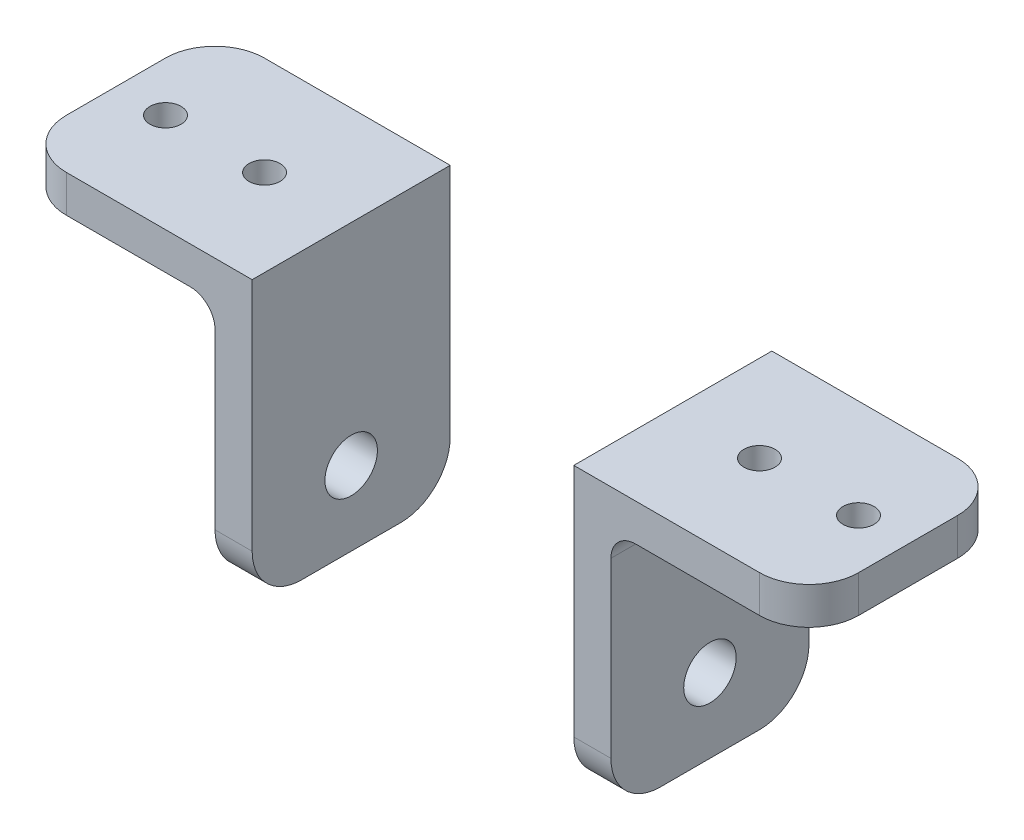
ISO-10303-21;
HEADER;
FILE_DESCRIPTION(('STEP AP214'),'2;1');
FILE_NAME('part.step','',(''),(''),'','','');
FILE_SCHEMA(('AUTOMOTIVE_DESIGN { 1 0 10303 214 1 1 1 1 }'));
ENDSEC;
DATA;
#1=APPLICATION_CONTEXT('core data for automotive mechanical design processes');
#2=APPLICATION_PROTOCOL_DEFINITION('international standard','automotive_design',2000,#1);
#3=PRODUCT_CONTEXT('',#1,'mechanical');
#4=PRODUCT('Part','Part','',(#3));
#5=PRODUCT_RELATED_PRODUCT_CATEGORY('part','',(#4));
#6=PRODUCT_DEFINITION_FORMATION('','',#4);
#7=PRODUCT_DEFINITION_CONTEXT('part definition',#1,'design');
#8=PRODUCT_DEFINITION('design','',#6,#7);
#9=PRODUCT_DEFINITION_SHAPE('','',#8);
#10=(LENGTH_UNIT() NAMED_UNIT(*) SI_UNIT(.MILLI.,.METRE.));
#11=(NAMED_UNIT(*) PLANE_ANGLE_UNIT() SI_UNIT($,.RADIAN.));
#12=(NAMED_UNIT(*) SI_UNIT($,.STERADIAN.) SOLID_ANGLE_UNIT());
#13=UNCERTAINTY_MEASURE_WITH_UNIT(LENGTH_MEASURE(1.E-05),#10,'distance_accuracy_value','');
#14=(GEOMETRIC_REPRESENTATION_CONTEXT(3) GLOBAL_UNCERTAINTY_ASSIGNED_CONTEXT((#13)) GLOBAL_UNIT_ASSIGNED_CONTEXT((#10,
#11,#12)) REPRESENTATION_CONTEXT('',''));
#15=CARTESIAN_POINT('',(0.,0.,0.));
#16=DIRECTION('',(0.,0.,1.));
#17=DIRECTION('',(1.,0.,0.));
#18=AXIS2_PLACEMENT_3D('',#15,#16,#17);
#19=CARTESIAN_POINT('',(260.35,-50.8,1168.4));
#20=DIRECTION('',(0.,-1.,0.));
#21=DIRECTION('',(0.,0.,-1.));
#22=AXIS2_PLACEMENT_3D('',#19,#20,#21);
#23=PLANE('',#22);
#24=CARTESIAN_POINT('',(304.7873,-50.8,1181.1));
#25=DIRECTION('',(0.,-1.,0.));
#26=DIRECTION('',(0.,0.,-1.));
#27=AXIS2_PLACEMENT_3D('',#24,#25,#26);
#28=CIRCLE('',#27,1.9939);
#29=CARTESIAN_POINT('',(304.7873,-50.8,1179.1061));
#30=VERTEX_POINT('',#29);
#31=EDGE_CURVE('P0_E132',#30,#30,#28,.F.);
#32=ORIENTED_EDGE('',*,*,#31,.F.);
#33=EDGE_LOOP('',(#32));
#34=FACE_BOUND('',#33,.T.);
#35=CARTESIAN_POINT('',(292.0873,-50.8,1181.1));
#36=DIRECTION('',(0.,-1.,0.));
#37=DIRECTION('',(0.,0.,-1.));
#38=AXIS2_PLACEMENT_3D('',#35,#36,#37);
#39=CIRCLE('',#38,1.9939);
#40=CARTESIAN_POINT('',(292.0873,-50.8,1179.1061));
#41=VERTEX_POINT('',#40);
#42=EDGE_CURVE('P0_E343',#41,#41,#39,.F.);
#43=ORIENTED_EDGE('',*,*,#42,.F.);
#44=EDGE_LOOP('',(#43));
#45=FACE_BOUND('',#44,.T.);
#46=DIRECTION('',(0.,0.,1.));
#47=VECTOR('',#46,1.);
#48=CARTESIAN_POINT('',(311.15,-50.8,1168.4));
#49=LINE('',#48,#47);
#50=CARTESIAN_POINT('',(311.15,-50.8,1174.75));
#51=VERTEX_POINT('',#50);
#52=CARTESIAN_POINT('',(311.15,-50.8,1187.45));
#53=VERTEX_POINT('',#52);
#54=EDGE_CURVE('P0_E139',#51,#53,#49,.T.);
#55=ORIENTED_EDGE('',*,*,#54,.F.);
#56=CARTESIAN_POINT('',(304.8,-50.8,1174.75));
#57=DIRECTION('',(0.,-1.,0.));
#58=DIRECTION('',(0.,0.,-1.));
#59=AXIS2_PLACEMENT_3D('',#56,#57,#58);
#60=CIRCLE('',#59,6.35);
#61=CARTESIAN_POINT('',(304.8,-50.8,1168.4));
#62=VERTEX_POINT('',#61);
#63=EDGE_CURVE('P0_E125',#51,#62,#60,.F.);
#64=ORIENTED_EDGE('',*,*,#63,.T.);
#65=DIRECTION('',(1.,0.,0.));
#66=VECTOR('',#65,1.);
#67=CARTESIAN_POINT('',(260.35,-50.8,1168.4));
#68=LINE('',#67,#66);
#69=CARTESIAN_POINT('',(280.9748,-50.8,1168.4));
#70=VERTEX_POINT('',#69);
#71=EDGE_CURVE('P0_E118',#70,#62,#68,.T.);
#72=ORIENTED_EDGE('',*,*,#71,.F.);
#73=DIRECTION('',(0.,0.,1.));
#74=VECTOR('',#73,1.);
#75=CARTESIAN_POINT('',(280.9748,-50.8,1168.4));
#76=LINE('',#75,#74);
#77=CARTESIAN_POINT('',(280.9748,-50.8,1193.8));
#78=VERTEX_POINT('',#77);
#79=EDGE_CURVE('P0_E101',#70,#78,#76,.T.);
#80=ORIENTED_EDGE('',*,*,#79,.T.);
#81=DIRECTION('',(1.,0.,0.));
#82=VECTOR('',#81,1.);
#83=CARTESIAN_POINT('',(260.35,-50.8,1193.8));
#84=LINE('',#83,#82);
#85=CARTESIAN_POINT('',(304.8,-50.8,1193.8));
#86=VERTEX_POINT('',#85);
#87=EDGE_CURVE('P0_E140',#78,#86,#84,.T.);
#88=ORIENTED_EDGE('',*,*,#87,.T.);
#89=CARTESIAN_POINT('',(304.8,-50.8,1187.45));
#90=DIRECTION('',(0.,-1.,0.));
#91=DIRECTION('',(0.,0.,-1.));
#92=AXIS2_PLACEMENT_3D('',#89,#90,#91);
#93=CIRCLE('',#92,6.35);
#94=EDGE_CURVE('P0_E167',#86,#53,#93,.F.);
#95=ORIENTED_EDGE('',*,*,#94,.T.);
#96=EDGE_LOOP('',(#55,#64,#72,#80,#88,#95));
#97=FACE_BOUND('',#96,.T.);
#98=ADVANCED_FACE('P0_F17',(#34,#45,#97),#23,.F.);
#99=CARTESIAN_POINT('',(280.9748,-69.05625,1168.4));
#100=DIRECTION('',(-1.,0.,0.));
#101=DIRECTION('',(0.,0.,1.));
#102=AXIS2_PLACEMENT_3D('',#99,#100,#101);
#103=PLANE('',#102);
#104=CARTESIAN_POINT('',(280.9748,-77.7875,1181.1));
#105=DIRECTION('',(-1.,0.,0.));
#106=DIRECTION('',(0.,0.,1.));
#107=AXIS2_PLACEMENT_3D('',#104,#105,#106);
#108=CIRCLE('',#107,3.3655);
#109=CARTESIAN_POINT('',(280.9748,-77.7875,1184.4655));
#110=VERTEX_POINT('',#109);
#111=EDGE_CURVE('P0_E332',#110,#110,#108,.T.);
#112=ORIENTED_EDGE('',*,*,#111,.F.);
#113=EDGE_LOOP('',(#112));
#114=FACE_BOUND('',#113,.T.);
#115=DIRECTION('',(0.,-1.,0.));
#116=VECTOR('',#115,1.);
#117=CARTESIAN_POINT('',(280.9748,-69.05625,1168.4));
#118=LINE('',#117,#116);
#119=CARTESIAN_POINT('',(280.9748,-80.9625,1168.4));
#120=VERTEX_POINT('',#119);
#121=EDGE_CURVE('P0_E104',#70,#120,#118,.T.);
#122=ORIENTED_EDGE('',*,*,#121,.T.);
#123=CARTESIAN_POINT('',(280.9748,-80.9625,1174.75));
#124=DIRECTION('',(-1.,0.,0.));
#125=DIRECTION('',(0.,0.,1.));
#126=AXIS2_PLACEMENT_3D('',#123,#124,#125);
#127=CIRCLE('',#126,6.35);
#128=CARTESIAN_POINT('',(280.9748,-87.3125,1174.75));
#129=VERTEX_POINT('',#128);
#130=EDGE_CURVE('P0_E11',#120,#129,#127,.T.);
#131=ORIENTED_EDGE('',*,*,#130,.T.);
#132=DIRECTION('',(0.,0.,1.));
#133=VECTOR('',#132,1.);
#134=CARTESIAN_POINT('',(280.9748,-87.3125,1168.4));
#135=LINE('',#134,#133);
#136=CARTESIAN_POINT('',(280.9748,-87.3125,1187.45));
#137=VERTEX_POINT('',#136);
#138=EDGE_CURVE('P0_E113',#129,#137,#135,.T.);
#139=ORIENTED_EDGE('',*,*,#138,.T.);
#140=CARTESIAN_POINT('',(280.9748,-80.9625,1187.45));
#141=DIRECTION('',(-1.,0.,0.));
#142=DIRECTION('',(0.,0.,1.));
#143=AXIS2_PLACEMENT_3D('',#140,#141,#142);
#144=CIRCLE('',#143,6.35);
#145=CARTESIAN_POINT('',(280.9748,-80.9625,1193.8));
#146=VERTEX_POINT('',#145);
#147=EDGE_CURVE('P0_E25',#137,#146,#144,.T.);
#148=ORIENTED_EDGE('',*,*,#147,.T.);
#149=DIRECTION('',(0.,-1.,0.));
#150=VECTOR('',#149,1.);
#151=CARTESIAN_POINT('',(280.9748,-69.05625,1193.8));
#152=LINE('',#151,#150);
#153=EDGE_CURVE('P0_E107',#78,#146,#152,.T.);
#154=ORIENTED_EDGE('',*,*,#153,.F.);
#155=ORIENTED_EDGE('',*,*,#79,.F.);
#156=EDGE_LOOP('',(#122,#131,#139,#148,#154,#155));
#157=FACE_BOUND('',#156,.T.);
#158=ADVANCED_FACE('P0_F103',(#114,#157),#103,.T.);
#159=CARTESIAN_POINT('',(283.35605,-87.3125,1168.4));
#160=DIRECTION('',(0.,-1.,0.));
#161=DIRECTION('',(0.,0.,-1.));
#162=AXIS2_PLACEMENT_3D('',#159,#160,#161);
#163=PLANE('',#162);
#164=ORIENTED_EDGE('',*,*,#138,.F.);
#165=DIRECTION('',(1.,0.,0.));
#166=VECTOR('',#165,1.);
#167=CARTESIAN_POINT('',(285.7373,-87.3125,1174.75));
#168=LINE('',#167,#166);
#169=CARTESIAN_POINT('',(285.7373,-87.3125,1174.75));
#170=VERTEX_POINT('',#169);
#171=EDGE_CURVE('P0_E185',#129,#170,#168,.T.);
#172=ORIENTED_EDGE('',*,*,#171,.T.);
#173=DIRECTION('',(0.,0.,1.));
#174=VECTOR('',#173,1.);
#175=CARTESIAN_POINT('',(285.7373,-87.3125,1168.4));
#176=LINE('',#175,#174);
#177=CARTESIAN_POINT('',(285.7373,-87.3125,1187.45));
#178=VERTEX_POINT('',#177);
#179=EDGE_CURVE('P0_E149',#170,#178,#176,.T.);
#180=ORIENTED_EDGE('',*,*,#179,.T.);
#181=DIRECTION('',(1.,0.,0.));
#182=VECTOR('',#181,1.);
#183=CARTESIAN_POINT('',(283.35605,-87.3125,1187.45));
#184=LINE('',#183,#182);
#185=EDGE_CURVE('P0_E183',#178,#137,#184,.F.);
#186=ORIENTED_EDGE('',*,*,#185,.T.);
#187=EDGE_LOOP('',(#164,#172,#180,#186));
#188=FACE_BOUND('',#187,.T.);
#189=ADVANCED_FACE('P0_F196',(#188),#163,.T.);
#190=CARTESIAN_POINT('',(285.7373,-71.4375,1168.4));
#191=DIRECTION('',(1.,0.,0.));
#192=DIRECTION('',(0.,0.,-1.));
#193=AXIS2_PLACEMENT_3D('',#190,#191,#192);
#194=PLANE('',#193);
#195=CARTESIAN_POINT('',(285.7373,-77.7875,1181.1));
#196=DIRECTION('',(1.,0.,0.));
#197=DIRECTION('',(0.,0.,-1.));
#198=AXIS2_PLACEMENT_3D('',#195,#196,#197);
#199=CIRCLE('',#198,3.3655);
#200=CARTESIAN_POINT('',(285.7373,-77.7875,1177.7345));
#201=VERTEX_POINT('',#200);
#202=EDGE_CURVE('P0_E335',#201,#201,#199,.F.);
#203=ORIENTED_EDGE('',*,*,#202,.T.);
#204=EDGE_LOOP('',(#203));
#205=FACE_BOUND('',#204,.T.);
#206=ORIENTED_EDGE('',*,*,#179,.F.);
#207=CARTESIAN_POINT('',(285.7373,-80.9625,1174.75));
#208=DIRECTION('',(1.,0.,0.));
#209=DIRECTION('',(0.,0.,-1.));
#210=AXIS2_PLACEMENT_3D('',#207,#208,#209);
#211=CIRCLE('',#210,6.35);
#212=CARTESIAN_POINT('',(285.7373,-80.9625,1168.4));
#213=VERTEX_POINT('',#212);
#214=EDGE_CURVE('P0_E40',#170,#213,#211,.T.);
#215=ORIENTED_EDGE('',*,*,#214,.T.);
#216=DIRECTION('',(0.,1.,0.));
#217=VECTOR('',#216,1.);
#218=CARTESIAN_POINT('',(285.7373,-71.4375,1168.4));
#219=LINE('',#218,#217);
#220=CARTESIAN_POINT('',(285.7373,-58.7375,1168.4));
#221=VERTEX_POINT('',#220);
#222=EDGE_CURVE('P0_E122',#213,#221,#219,.T.);
#223=ORIENTED_EDGE('',*,*,#222,.T.);
#224=DIRECTION('',(0.,0.,1.));
#225=VECTOR('',#224,1.);
#226=CARTESIAN_POINT('',(285.7373,-58.7375,1193.8));
#227=LINE('',#226,#225);
#228=CARTESIAN_POINT('',(285.7373,-58.7375,1193.8));
#229=VERTEX_POINT('',#228);
#230=EDGE_CURVE('P0_E112',#221,#229,#227,.T.);
#231=ORIENTED_EDGE('',*,*,#230,.T.);
#232=DIRECTION('',(0.,1.,0.));
#233=VECTOR('',#232,1.);
#234=CARTESIAN_POINT('',(285.7373,-71.4375,1193.8));
#235=LINE('',#234,#233);
#236=CARTESIAN_POINT('',(285.7373,-80.9625,1193.8));
#237=VERTEX_POINT('',#236);
#238=EDGE_CURVE('P0_E129',#237,#229,#235,.T.);
#239=ORIENTED_EDGE('',*,*,#238,.F.);
#240=CARTESIAN_POINT('',(285.7373,-80.9625,1187.45));
#241=DIRECTION('',(1.,0.,0.));
#242=DIRECTION('',(0.,0.,-1.));
#243=AXIS2_PLACEMENT_3D('',#240,#241,#242);
#244=CIRCLE('',#243,6.35);
#245=EDGE_CURVE('P0_E32',#237,#178,#244,.T.);
#246=ORIENTED_EDGE('',*,*,#245,.T.);
#247=EDGE_LOOP('',(#206,#215,#223,#231,#239,#246));
#248=FACE_BOUND('',#247,.T.);
#249=ADVANCED_FACE('P0_F197',(#205,#248),#194,.T.);
#250=CARTESIAN_POINT('',(298.44365,-55.5625,1168.4));
#251=DIRECTION('',(0.,-1.,0.));
#252=DIRECTION('',(0.,0.,-1.));
#253=AXIS2_PLACEMENT_3D('',#250,#251,#252);
#254=PLANE('',#253);
#255=CARTESIAN_POINT('',(304.7873,-55.5625,1181.1));
#256=DIRECTION('',(0.,1.,0.));
#257=DIRECTION('',(0.,0.,-1.));
#258=AXIS2_PLACEMENT_3D('',#255,#256,#257);
#259=CIRCLE('',#258,1.9939);
#260=CARTESIAN_POINT('',(304.7873,-55.5625,1179.1061));
#261=VERTEX_POINT('',#260);
#262=EDGE_CURVE('P0_E340',#261,#261,#259,.T.);
#263=ORIENTED_EDGE('',*,*,#262,.T.);
#264=EDGE_LOOP('',(#263));
#265=FACE_BOUND('',#264,.T.);
#266=CARTESIAN_POINT('',(292.0873,-55.5625,1181.1));
#267=DIRECTION('',(0.,1.,0.));
#268=DIRECTION('',(0.,0.,-1.));
#269=AXIS2_PLACEMENT_3D('',#266,#267,#268);
#270=CIRCLE('',#269,1.9939);
#271=CARTESIAN_POINT('',(292.0873,-55.5625,1179.1061));
#272=VERTEX_POINT('',#271);
#273=EDGE_CURVE('P0_E337',#272,#272,#270,.T.);
#274=ORIENTED_EDGE('',*,*,#273,.T.);
#275=EDGE_LOOP('',(#274));
#276=FACE_BOUND('',#275,.T.);
#277=DIRECTION('',(1.,0.,0.));
#278=VECTOR('',#277,1.);
#279=CARTESIAN_POINT('',(298.44365,-55.5625,1168.4));
#280=LINE('',#279,#278);
#281=CARTESIAN_POINT('',(288.9123,-55.5625,1168.4));
#282=VERTEX_POINT('',#281);
#283=CARTESIAN_POINT('',(304.8,-55.5625,1168.4));
#284=VERTEX_POINT('',#283);
#285=EDGE_CURVE('P0_E136',#282,#284,#280,.T.);
#286=ORIENTED_EDGE('',*,*,#285,.T.);
#287=CARTESIAN_POINT('',(304.8,-55.5625,1174.75));
#288=DIRECTION('',(0.,-1.,0.));
#289=DIRECTION('',(0.,0.,-1.));
#290=AXIS2_PLACEMENT_3D('',#287,#288,#289);
#291=CIRCLE('',#290,6.35);
#292=CARTESIAN_POINT('',(311.15,-55.5625,1174.75));
#293=VERTEX_POINT('',#292);
#294=EDGE_CURVE('P0_E175',#284,#293,#291,.T.);
#295=ORIENTED_EDGE('',*,*,#294,.T.);
#296=DIRECTION('',(0.,0.,1.));
#297=VECTOR('',#296,1.);
#298=CARTESIAN_POINT('',(311.15,-55.5625,1168.4));
#299=LINE('',#298,#297);
#300=CARTESIAN_POINT('',(311.15,-55.5625,1187.45));
#301=VERTEX_POINT('',#300);
#302=EDGE_CURVE('P0_E146',#293,#301,#299,.T.);
#303=ORIENTED_EDGE('',*,*,#302,.T.);
#304=CARTESIAN_POINT('',(304.8,-55.5625,1187.45));
#305=DIRECTION('',(0.,-1.,0.));
#306=DIRECTION('',(0.,0.,-1.));
#307=AXIS2_PLACEMENT_3D('',#304,#305,#306);
#308=CIRCLE('',#307,6.35);
#309=CARTESIAN_POINT('',(304.8,-55.5625,1193.8));
#310=VERTEX_POINT('',#309);
#311=EDGE_CURVE('P0_E173',#301,#310,#308,.T.);
#312=ORIENTED_EDGE('',*,*,#311,.T.);
#313=DIRECTION('',(1.,0.,0.));
#314=VECTOR('',#313,1.);
#315=CARTESIAN_POINT('',(298.44365,-55.5625,1193.8));
#316=LINE('',#315,#314);
#317=CARTESIAN_POINT('',(288.9123,-55.5625,1193.8));
#318=VERTEX_POINT('',#317);
#319=EDGE_CURVE('P0_E126',#318,#310,#316,.T.);
#320=ORIENTED_EDGE('',*,*,#319,.F.);
#321=DIRECTION('',(0.,0.,1.));
#322=VECTOR('',#321,1.);
#323=CARTESIAN_POINT('',(288.9123,-55.5625,1168.4));
#324=LINE('',#323,#322);
#325=EDGE_CURVE('P0_E155',#318,#282,#324,.F.);
#326=ORIENTED_EDGE('',*,*,#325,.T.);
#327=EDGE_LOOP('',(#286,#295,#303,#312,#320,#326));
#328=FACE_BOUND('',#327,.T.);
#329=ADVANCED_FACE('P0_F237',(#265,#276,#328),#254,.T.);
#330=CARTESIAN_POINT('',(311.15,-53.18125,1168.4));
#331=DIRECTION('',(1.,0.,0.));
#332=DIRECTION('',(0.,0.,-1.));
#333=AXIS2_PLACEMENT_3D('',#330,#331,#332);
#334=PLANE('',#333);
#335=ORIENTED_EDGE('',*,*,#302,.F.);
#336=DIRECTION('',(0.,1.,0.));
#337=VECTOR('',#336,1.);
#338=CARTESIAN_POINT('',(311.15,-50.8,1174.75));
#339=LINE('',#338,#337);
#340=EDGE_CURVE('P0_E164',#293,#51,#339,.T.);
#341=ORIENTED_EDGE('',*,*,#340,.T.);
#342=ORIENTED_EDGE('',*,*,#54,.T.);
#343=DIRECTION('',(0.,1.,0.));
#344=VECTOR('',#343,1.);
#345=CARTESIAN_POINT('',(311.15,-53.18125,1187.45));
#346=LINE('',#345,#344);
#347=EDGE_CURVE('P0_E162',#53,#301,#346,.F.);
#348=ORIENTED_EDGE('',*,*,#347,.T.);
#349=EDGE_LOOP('',(#335,#341,#342,#348));
#350=FACE_BOUND('',#349,.T.);
#351=ADVANCED_FACE('P0_F240',(#350),#334,.T.);
#352=CARTESIAN_POINT('',(260.35,-43.65625,1168.4));
#353=DIRECTION('',(0.,0.,1.));
#354=DIRECTION('',(1.,0.,0.));
#355=AXIS2_PLACEMENT_3D('',#352,#353,#354);
#356=PLANE('',#355);
#357=ORIENTED_EDGE('',*,*,#71,.T.);
#358=DIRECTION('',(0.,1.,0.));
#359=VECTOR('',#358,1.);
#360=CARTESIAN_POINT('',(304.8,-55.5625,1168.4));
#361=LINE('',#360,#359);
#362=EDGE_CURVE('P0_E171',#62,#284,#361,.F.);
#363=ORIENTED_EDGE('',*,*,#362,.T.);
#364=ORIENTED_EDGE('',*,*,#285,.F.);
#365=CARTESIAN_POINT('',(288.9123,-58.7375,1168.4));
#366=DIRECTION('',(0.,0.,1.));
#367=DIRECTION('',(1.,0.,0.));
#368=AXIS2_PLACEMENT_3D('',#365,#366,#367);
#369=CIRCLE('',#368,3.175);
#370=EDGE_CURVE('P0_E159',#282,#221,#369,.T.);
#371=ORIENTED_EDGE('',*,*,#370,.T.);
#372=ORIENTED_EDGE('',*,*,#222,.F.);
#373=DIRECTION('',(1.,0.,0.));
#374=VECTOR('',#373,1.);
#375=CARTESIAN_POINT('',(280.9748,-80.9625,1168.4));
#376=LINE('',#375,#374);
#377=EDGE_CURVE('P0_E121',#213,#120,#376,.F.);
#378=ORIENTED_EDGE('',*,*,#377,.T.);
#379=ORIENTED_EDGE('',*,*,#121,.F.);
#380=EDGE_LOOP('',(#357,#363,#364,#371,#372,#378,#379));
#381=FACE_BOUND('',#380,.T.);
#382=ADVANCED_FACE('P0_F117',(#381),#356,.F.);
#383=CARTESIAN_POINT('',(260.35,-43.65625,1193.8));
#384=DIRECTION('',(0.,0.,1.));
#385=DIRECTION('',(1.,0.,0.));
#386=AXIS2_PLACEMENT_3D('',#383,#384,#385);
#387=PLANE('',#386);
#388=ORIENTED_EDGE('',*,*,#319,.T.);
#389=DIRECTION('',(0.,1.,0.));
#390=VECTOR('',#389,1.);
#391=CARTESIAN_POINT('',(304.8,-43.65625,1193.8));
#392=LINE('',#391,#390);
#393=EDGE_CURVE('P0_E180',#310,#86,#392,.T.);
#394=ORIENTED_EDGE('',*,*,#393,.T.);
#395=ORIENTED_EDGE('',*,*,#87,.F.);
#396=ORIENTED_EDGE('',*,*,#153,.T.);
#397=DIRECTION('',(1.,0.,0.));
#398=VECTOR('',#397,1.);
#399=CARTESIAN_POINT('',(260.35,-80.9625,1193.8));
#400=LINE('',#399,#398);
#401=EDGE_CURVE('P0_E177',#146,#237,#400,.T.);
#402=ORIENTED_EDGE('',*,*,#401,.T.);
#403=ORIENTED_EDGE('',*,*,#238,.T.);
#404=CARTESIAN_POINT('',(288.9123,-58.7375,1193.8));
#405=DIRECTION('',(0.,0.,1.));
#406=DIRECTION('',(1.,0.,0.));
#407=AXIS2_PLACEMENT_3D('',#404,#405,#406);
#408=CIRCLE('',#407,3.175);
#409=EDGE_CURVE('P0_E157',#229,#318,#408,.F.);
#410=ORIENTED_EDGE('',*,*,#409,.T.);
#411=EDGE_LOOP('',(#388,#394,#395,#396,#402,#403,#410));
#412=FACE_BOUND('',#411,.T.);
#413=ADVANCED_FACE('P0_F194',(#412),#387,.T.);
#414=CARTESIAN_POINT('',(292.0873,1253.44045163224,1181.1));
#415=DIRECTION('',(0.,-1.,0.));
#416=DIRECTION('',(0.,0.,-1.));
#417=AXIS2_PLACEMENT_3D('',#414,#415,#416);
#418=CYLINDRICAL_SURFACE('',#417,1.9939);
#419=ORIENTED_EDGE('',*,*,#273,.F.);
#420=EDGE_LOOP('',(#419));
#421=FACE_BOUND('',#420,.T.);
#422=ORIENTED_EDGE('',*,*,#42,.T.);
#423=EDGE_LOOP('',(#422));
#424=FACE_BOUND('',#423,.T.);
#425=ADVANCED_FACE('P0_F290',(#421,#424),#418,.F.);
#426=CARTESIAN_POINT('',(304.7873,1253.44045163224,1181.1));
#427=DIRECTION('',(0.,-1.,0.));
#428=DIRECTION('',(0.,0.,-1.));
#429=AXIS2_PLACEMENT_3D('',#426,#427,#428);
#430=CYLINDRICAL_SURFACE('',#429,1.9939);
#431=ORIENTED_EDGE('',*,*,#262,.F.);
#432=EDGE_LOOP('',(#431));
#433=FACE_BOUND('',#432,.T.);
#434=ORIENTED_EDGE('',*,*,#31,.T.);
#435=EDGE_LOOP('',(#434));
#436=FACE_BOUND('',#435,.T.);
#437=ADVANCED_FACE('P0_F296',(#433,#436),#430,.F.);
#438=CARTESIAN_POINT('',(285.7393,-77.7875,1181.1));
#439=DIRECTION('',(-1.,0.,0.));
#440=DIRECTION('',(0.,0.,1.));
#441=AXIS2_PLACEMENT_3D('',#438,#439,#440);
#442=CYLINDRICAL_SURFACE('',#441,3.3655);
#443=ORIENTED_EDGE('',*,*,#111,.T.);
#444=EDGE_LOOP('',(#443));
#445=FACE_BOUND('',#444,.T.);
#446=ORIENTED_EDGE('',*,*,#202,.F.);
#447=EDGE_LOOP('',(#446));
#448=FACE_BOUND('',#447,.T.);
#449=ADVANCED_FACE('P0_F227',(#445,#448),#442,.F.);
#450=CARTESIAN_POINT('',(288.9123,-58.7375,1168.4));
#451=DIRECTION('',(0.,0.,-1.));
#452=DIRECTION('',(-1.,0.,0.));
#453=AXIS2_PLACEMENT_3D('',#450,#451,#452);
#454=CYLINDRICAL_SURFACE('',#453,3.175);
#455=ORIENTED_EDGE('',*,*,#370,.F.);
#456=ORIENTED_EDGE('',*,*,#325,.F.);
#457=ORIENTED_EDGE('',*,*,#409,.F.);
#458=ORIENTED_EDGE('',*,*,#230,.F.);
#459=EDGE_LOOP('',(#455,#456,#457,#458));
#460=FACE_BOUND('',#459,.T.);
#461=ADVANCED_FACE('P0_F224',(#460),#454,.F.);
#462=CARTESIAN_POINT('',(304.8,-53.18125,1174.75));
#463=DIRECTION('',(0.,-1.,0.));
#464=DIRECTION('',(0.,0.,-1.));
#465=AXIS2_PLACEMENT_3D('',#462,#463,#464);
#466=CYLINDRICAL_SURFACE('',#465,6.35);
#467=ORIENTED_EDGE('',*,*,#294,.F.);
#468=ORIENTED_EDGE('',*,*,#362,.F.);
#469=ORIENTED_EDGE('',*,*,#63,.F.);
#470=ORIENTED_EDGE('',*,*,#340,.F.);
#471=EDGE_LOOP('',(#467,#468,#469,#470));
#472=FACE_BOUND('',#471,.T.);
#473=ADVANCED_FACE('P0_F209',(#472),#466,.T.);
#474=CARTESIAN_POINT('',(304.8,-43.65625,1187.45));
#475=DIRECTION('',(0.,1.,0.));
#476=DIRECTION('',(0.,0.,1.));
#477=AXIS2_PLACEMENT_3D('',#474,#475,#476);
#478=CYLINDRICAL_SURFACE('',#477,6.35);
#479=ORIENTED_EDGE('',*,*,#311,.F.);
#480=ORIENTED_EDGE('',*,*,#347,.F.);
#481=ORIENTED_EDGE('',*,*,#94,.F.);
#482=ORIENTED_EDGE('',*,*,#393,.F.);
#483=EDGE_LOOP('',(#479,#480,#481,#482));
#484=FACE_BOUND('',#483,.T.);
#485=ADVANCED_FACE('P0_F203',(#484),#478,.T.);
#486=CARTESIAN_POINT('',(283.35605,-80.9625,1174.75));
#487=DIRECTION('',(-1.,0.,0.));
#488=DIRECTION('',(0.,0.,1.));
#489=AXIS2_PLACEMENT_3D('',#486,#487,#488);
#490=CYLINDRICAL_SURFACE('',#489,6.35);
#491=ORIENTED_EDGE('',*,*,#130,.F.);
#492=ORIENTED_EDGE('',*,*,#377,.F.);
#493=ORIENTED_EDGE('',*,*,#214,.F.);
#494=ORIENTED_EDGE('',*,*,#171,.F.);
#495=EDGE_LOOP('',(#491,#492,#493,#494));
#496=FACE_BOUND('',#495,.T.);
#497=ADVANCED_FACE('P0_F201',(#496),#490,.T.);
#498=CARTESIAN_POINT('',(260.35,-80.9625,1187.45));
#499=DIRECTION('',(1.,0.,0.));
#500=DIRECTION('',(0.,0.,-1.));
#501=AXIS2_PLACEMENT_3D('',#498,#499,#500);
#502=CYLINDRICAL_SURFACE('',#501,6.35);
#503=ORIENTED_EDGE('',*,*,#147,.F.);
#504=ORIENTED_EDGE('',*,*,#185,.F.);
#505=ORIENTED_EDGE('',*,*,#245,.F.);
#506=ORIENTED_EDGE('',*,*,#401,.F.);
#507=EDGE_LOOP('',(#503,#504,#505,#506));
#508=FACE_BOUND('',#507,.T.);
#509=ADVANCED_FACE('P0_F19',(#508),#502,.T.);
#510=CLOSED_SHELL('',(#98,#158,#189,#249,#329,#351,#382,#413,#425,#437,#449,#461,#473,#485,#497,#509));
#511=MANIFOLD_SOLID_BREP('P0_B1',#510);
#512=CARTESIAN_POINT('',(239.7252,-69.05625,1168.4));
#513=DIRECTION('',(-1.,0.,0.));
#514=DIRECTION('',(0.,0.,1.));
#515=AXIS2_PLACEMENT_3D('',#512,#513,#514);
#516=PLANE('',#515);
#517=CARTESIAN_POINT('',(239.7252,-77.7875,1181.1));
#518=DIRECTION('',(-1.,0.,0.));
#519=DIRECTION('',(0.,0.,1.));
#520=AXIS2_PLACEMENT_3D('',#517,#518,#519);
#521=CIRCLE('',#520,3.3655);
#522=CARTESIAN_POINT('',(239.7252,-77.7875,1184.4655));
#523=VERTEX_POINT('',#522);
#524=EDGE_CURVE('P1_E273',#523,#523,#521,.T.);
#525=ORIENTED_EDGE('',*,*,#524,.T.);
#526=EDGE_LOOP('',(#525));
#527=FACE_BOUND('',#526,.T.);
#528=DIRECTION('',(0.,0.,1.));
#529=VECTOR('',#528,1.);
#530=CARTESIAN_POINT('',(239.7252,-87.3125,1168.4));
#531=LINE('',#530,#529);
#532=CARTESIAN_POINT('',(239.7252,-87.3125,1174.75));
#533=VERTEX_POINT('',#532);
#534=CARTESIAN_POINT('',(239.7252,-87.3125,1187.45));
#535=VERTEX_POINT('',#534);
#536=EDGE_CURVE('P1_E124',#533,#535,#531,.T.);
#537=ORIENTED_EDGE('',*,*,#536,.F.);
#538=CARTESIAN_POINT('',(239.7252,-80.9625,1174.75));
#539=DIRECTION('',(-1.,0.,0.));
#540=DIRECTION('',(0.,0.,1.));
#541=AXIS2_PLACEMENT_3D('',#538,#539,#540);
#542=CIRCLE('',#541,6.35);
#543=CARTESIAN_POINT('',(239.7252,-80.9625,1168.4));
#544=VERTEX_POINT('',#543);
#545=EDGE_CURVE('P1_E11',#533,#544,#542,.F.);
#546=ORIENTED_EDGE('',*,*,#545,.T.);
#547=DIRECTION('',(0.,-1.,0.));
#548=VECTOR('',#547,1.);
#549=CARTESIAN_POINT('',(239.7252,-69.05625,1168.4));
#550=LINE('',#549,#548);
#551=CARTESIAN_POINT('',(239.7252,-50.8,1168.4));
#552=VERTEX_POINT('',#551);
#553=EDGE_CURVE('P1_E107',#552,#544,#550,.T.);
#554=ORIENTED_EDGE('',*,*,#553,.F.);
#555=DIRECTION('',(0.,0.,1.));
#556=VECTOR('',#555,1.);
#557=CARTESIAN_POINT('',(239.7252,-50.8,1168.4));
#558=LINE('',#557,#556);
#559=CARTESIAN_POINT('',(239.7252,-50.8,1193.8));
#560=VERTEX_POINT('',#559);
#561=EDGE_CURVE('P1_E115',#552,#560,#558,.T.);
#562=ORIENTED_EDGE('',*,*,#561,.T.);
#563=DIRECTION('',(0.,-1.,0.));
#564=VECTOR('',#563,1.);
#565=CARTESIAN_POINT('',(239.7252,-69.05625,1193.8));
#566=LINE('',#565,#564);
#567=CARTESIAN_POINT('',(239.7252,-80.9625,1193.8));
#568=VERTEX_POINT('',#567);
#569=EDGE_CURVE('P1_E137',#560,#568,#566,.T.);
#570=ORIENTED_EDGE('',*,*,#569,.T.);
#571=CARTESIAN_POINT('',(239.7252,-80.9625,1187.45));
#572=DIRECTION('',(-1.,0.,0.));
#573=DIRECTION('',(0.,0.,1.));
#574=AXIS2_PLACEMENT_3D('',#571,#572,#573);
#575=CIRCLE('',#574,6.35);
#576=EDGE_CURVE('P1_E25',#568,#535,#575,.F.);
#577=ORIENTED_EDGE('',*,*,#576,.T.);
#578=EDGE_LOOP('',(#537,#546,#554,#562,#570,#577));
#579=FACE_BOUND('',#578,.T.);
#580=ADVANCED_FACE('P1_F17',(#527,#579),#516,.F.);
#581=CARTESIAN_POINT('',(260.35,-50.8,1168.4));
#582=DIRECTION('',(0.,-1.,0.));
#583=DIRECTION('',(0.,0.,-1.));
#584=AXIS2_PLACEMENT_3D('',#581,#582,#583);
#585=PLANE('',#584);
#586=CARTESIAN_POINT('',(215.9127,-50.8,1181.1));
#587=DIRECTION('',(0.,-1.,0.));
#588=DIRECTION('',(0.,0.,-1.));
#589=AXIS2_PLACEMENT_3D('',#586,#587,#588);
#590=CIRCLE('',#589,1.9939);
#591=CARTESIAN_POINT('',(215.9127,-50.8,1179.1061));
#592=VERTEX_POINT('',#591);
#593=EDGE_CURVE('P1_E134',#592,#592,#590,.T.);
#594=ORIENTED_EDGE('',*,*,#593,.T.);
#595=EDGE_LOOP('',(#594));
#596=FACE_BOUND('',#595,.T.);
#597=CARTESIAN_POINT('',(228.6127,-50.8,1181.1));
#598=DIRECTION('',(0.,-1.,0.));
#599=DIRECTION('',(0.,0.,-1.));
#600=AXIS2_PLACEMENT_3D('',#597,#598,#599);
#601=CIRCLE('',#600,1.9939);
#602=CARTESIAN_POINT('',(228.6127,-50.8,1179.1061));
#603=VERTEX_POINT('',#602);
#604=EDGE_CURVE('P1_E282',#603,#603,#601,.T.);
#605=ORIENTED_EDGE('',*,*,#604,.T.);
#606=EDGE_LOOP('',(#605));
#607=FACE_BOUND('',#606,.T.);
#608=DIRECTION('',(1.,0.,0.));
#609=VECTOR('',#608,1.);
#610=CARTESIAN_POINT('',(260.35,-50.8,1168.4));
#611=LINE('',#610,#609);
#612=CARTESIAN_POINT('',(215.9,-50.8,1168.4));
#613=VERTEX_POINT('',#612);
#614=EDGE_CURVE('P1_E101',#613,#552,#611,.T.);
#615=ORIENTED_EDGE('',*,*,#614,.F.);
#616=CARTESIAN_POINT('',(215.9,-50.8,1174.75));
#617=DIRECTION('',(0.,-1.,0.));
#618=DIRECTION('',(0.,0.,-1.));
#619=AXIS2_PLACEMENT_3D('',#616,#617,#618);
#620=CIRCLE('',#619,6.35);
#621=CARTESIAN_POINT('',(209.55,-50.8,1174.75));
#622=VERTEX_POINT('',#621);
#623=EDGE_CURVE('P1_E163',#613,#622,#620,.F.);
#624=ORIENTED_EDGE('',*,*,#623,.T.);
#625=DIRECTION('',(0.,0.,1.));
#626=VECTOR('',#625,1.);
#627=CARTESIAN_POINT('',(209.55,-50.8,1168.4));
#628=LINE('',#627,#626);
#629=CARTESIAN_POINT('',(209.55,-50.8,1187.45));
#630=VERTEX_POINT('',#629);
#631=EDGE_CURVE('P1_E121',#622,#630,#628,.T.);
#632=ORIENTED_EDGE('',*,*,#631,.T.);
#633=CARTESIAN_POINT('',(215.9,-50.8,1187.45));
#634=DIRECTION('',(0.,-1.,0.));
#635=DIRECTION('',(0.,0.,-1.));
#636=AXIS2_PLACEMENT_3D('',#633,#634,#635);
#637=CIRCLE('',#636,6.35);
#638=CARTESIAN_POINT('',(215.9,-50.8,1193.8));
#639=VERTEX_POINT('',#638);
#640=EDGE_CURVE('P1_E161',#630,#639,#637,.F.);
#641=ORIENTED_EDGE('',*,*,#640,.T.);
#642=DIRECTION('',(1.,0.,0.));
#643=VECTOR('',#642,1.);
#644=CARTESIAN_POINT('',(260.35,-50.8,1193.8));
#645=LINE('',#644,#643);
#646=EDGE_CURVE('P1_E118',#639,#560,#645,.T.);
#647=ORIENTED_EDGE('',*,*,#646,.T.);
#648=ORIENTED_EDGE('',*,*,#561,.F.);
#649=EDGE_LOOP('',(#615,#624,#632,#641,#647,#648));
#650=FACE_BOUND('',#649,.T.);
#651=ADVANCED_FACE('P1_F116',(#596,#607,#650),#585,.F.);
#652=CARTESIAN_POINT('',(209.55,-53.18125,1168.4));
#653=DIRECTION('',(1.,0.,0.));
#654=DIRECTION('',(0.,0.,-1.));
#655=AXIS2_PLACEMENT_3D('',#652,#653,#654);
#656=PLANE('',#655);
#657=ORIENTED_EDGE('',*,*,#631,.F.);
#658=DIRECTION('',(0.,1.,0.));
#659=VECTOR('',#658,1.);
#660=CARTESIAN_POINT('',(209.55,-53.18125,1174.75));
#661=LINE('',#660,#659);
#662=CARTESIAN_POINT('',(209.55,-55.5625,1174.75));
#663=VERTEX_POINT('',#662);
#664=EDGE_CURVE('P1_E168',#622,#663,#661,.F.);
#665=ORIENTED_EDGE('',*,*,#664,.T.);
#666=DIRECTION('',(0.,0.,1.));
#667=VECTOR('',#666,1.);
#668=CARTESIAN_POINT('',(209.55,-55.5625,1168.4));
#669=LINE('',#668,#667);
#670=CARTESIAN_POINT('',(209.55,-55.5625,1187.45));
#671=VERTEX_POINT('',#670);
#672=EDGE_CURVE('P1_E143',#663,#671,#669,.T.);
#673=ORIENTED_EDGE('',*,*,#672,.T.);
#674=DIRECTION('',(0.,1.,0.));
#675=VECTOR('',#674,1.);
#676=CARTESIAN_POINT('',(209.55,-50.8,1187.45));
#677=LINE('',#676,#675);
#678=EDGE_CURVE('P1_E165',#671,#630,#677,.T.);
#679=ORIENTED_EDGE('',*,*,#678,.T.);
#680=EDGE_LOOP('',(#657,#665,#673,#679));
#681=FACE_BOUND('',#680,.T.);
#682=ADVANCED_FACE('P1_F214',(#681),#656,.F.);
#683=CARTESIAN_POINT('',(222.25635,-55.5625,1168.4));
#684=DIRECTION('',(0.,1.,0.));
#685=DIRECTION('',(0.,0.,1.));
#686=AXIS2_PLACEMENT_3D('',#683,#684,#685);
#687=PLANE('',#686);
#688=CARTESIAN_POINT('',(215.9127,-55.5625,1181.1));
#689=DIRECTION('',(0.,-1.,0.));
#690=DIRECTION('',(0.,0.,-1.));
#691=AXIS2_PLACEMENT_3D('',#688,#689,#690);
#692=CIRCLE('',#691,1.9939);
#693=CARTESIAN_POINT('',(215.9127,-55.5625,1179.1061));
#694=VERTEX_POINT('',#693);
#695=EDGE_CURVE('P1_E277',#694,#694,#692,.T.);
#696=ORIENTED_EDGE('',*,*,#695,.F.);
#697=EDGE_LOOP('',(#696));
#698=FACE_BOUND('',#697,.T.);
#699=CARTESIAN_POINT('',(228.6127,-55.5625,1181.1));
#700=DIRECTION('',(0.,-1.,0.));
#701=DIRECTION('',(0.,0.,-1.));
#702=AXIS2_PLACEMENT_3D('',#699,#700,#701);
#703=CIRCLE('',#702,1.9939);
#704=CARTESIAN_POINT('',(228.6127,-55.5625,1179.1061));
#705=VERTEX_POINT('',#704);
#706=EDGE_CURVE('P1_E274',#705,#705,#703,.T.);
#707=ORIENTED_EDGE('',*,*,#706,.F.);
#708=EDGE_LOOP('',(#707));
#709=FACE_BOUND('',#708,.T.);
#710=ORIENTED_EDGE('',*,*,#672,.F.);
#711=CARTESIAN_POINT('',(215.9,-55.5625,1174.75));
#712=DIRECTION('',(0.,1.,0.));
#713=DIRECTION('',(0.,0.,1.));
#714=AXIS2_PLACEMENT_3D('',#711,#712,#713);
#715=CIRCLE('',#714,6.35);
#716=CARTESIAN_POINT('',(215.9,-55.5625,1168.4));
#717=VERTEX_POINT('',#716);
#718=EDGE_CURVE('P1_E172',#663,#717,#715,.F.);
#719=ORIENTED_EDGE('',*,*,#718,.T.);
#720=DIRECTION('',(-1.,0.,0.));
#721=VECTOR('',#720,1.);
#722=CARTESIAN_POINT('',(222.25635,-55.5625,1168.4));
#723=LINE('',#722,#721);
#724=CARTESIAN_POINT('',(231.7877,-55.5625,1168.4));
#725=VERTEX_POINT('',#724);
#726=EDGE_CURVE('P1_E112',#725,#717,#723,.T.);
#727=ORIENTED_EDGE('',*,*,#726,.F.);
#728=DIRECTION('',(0.,0.,1.));
#729=VECTOR('',#728,1.);
#730=CARTESIAN_POINT('',(231.7877,-55.5625,1193.8));
#731=LINE('',#730,#729);
#732=CARTESIAN_POINT('',(231.7877,-55.5625,1193.8));
#733=VERTEX_POINT('',#732);
#734=EDGE_CURVE('P1_E120',#725,#733,#731,.T.);
#735=ORIENTED_EDGE('',*,*,#734,.T.);
#736=DIRECTION('',(-1.,0.,0.));
#737=VECTOR('',#736,1.);
#738=CARTESIAN_POINT('',(222.25635,-55.5625,1193.8));
#739=LINE('',#738,#737);
#740=CARTESIAN_POINT('',(215.9,-55.5625,1193.8));
#741=VERTEX_POINT('',#740);
#742=EDGE_CURVE('P1_E133',#733,#741,#739,.T.);
#743=ORIENTED_EDGE('',*,*,#742,.T.);
#744=CARTESIAN_POINT('',(215.9,-55.5625,1187.45));
#745=DIRECTION('',(0.,1.,0.));
#746=DIRECTION('',(0.,0.,1.));
#747=AXIS2_PLACEMENT_3D('',#744,#745,#746);
#748=CIRCLE('',#747,6.35);
#749=EDGE_CURVE('P1_E170',#741,#671,#748,.F.);
#750=ORIENTED_EDGE('',*,*,#749,.T.);
#751=EDGE_LOOP('',(#710,#719,#727,#735,#743,#750));
#752=FACE_BOUND('',#751,.T.);
#753=ADVANCED_FACE('P1_F203',(#698,#709,#752),#687,.F.);
#754=CARTESIAN_POINT('',(234.9627,-71.4375,1168.4));
#755=DIRECTION('',(1.,0.,0.));
#756=DIRECTION('',(0.,0.,-1.));
#757=AXIS2_PLACEMENT_3D('',#754,#755,#756);
#758=PLANE('',#757);
#759=CARTESIAN_POINT('',(234.9627,-77.7875,1181.1));
#760=DIRECTION('',(-1.,0.,0.));
#761=DIRECTION('',(0.,0.,1.));
#762=AXIS2_PLACEMENT_3D('',#759,#760,#761);
#763=CIRCLE('',#762,3.3655);
#764=CARTESIAN_POINT('',(234.9627,-77.7875,1184.4655));
#765=VERTEX_POINT('',#764);
#766=EDGE_CURVE('P1_E271',#765,#765,#763,.T.);
#767=ORIENTED_EDGE('',*,*,#766,.F.);
#768=EDGE_LOOP('',(#767));
#769=FACE_BOUND('',#768,.T.);
#770=DIRECTION('',(0.,1.,0.));
#771=VECTOR('',#770,1.);
#772=CARTESIAN_POINT('',(234.9627,-71.4375,1168.4));
#773=LINE('',#772,#771);
#774=CARTESIAN_POINT('',(234.9627,-80.9625,1168.4));
#775=VERTEX_POINT('',#774);
#776=CARTESIAN_POINT('',(234.9627,-58.7375,1168.4));
#777=VERTEX_POINT('',#776);
#778=EDGE_CURVE('P1_E139',#775,#777,#773,.T.);
#779=ORIENTED_EDGE('',*,*,#778,.F.);
#780=CARTESIAN_POINT('',(234.9627,-80.9625,1174.75));
#781=DIRECTION('',(1.,0.,0.));
#782=DIRECTION('',(0.,0.,-1.));
#783=AXIS2_PLACEMENT_3D('',#780,#781,#782);
#784=CIRCLE('',#783,6.35);
#785=CARTESIAN_POINT('',(234.9627,-87.3125,1174.75));
#786=VERTEX_POINT('',#785);
#787=EDGE_CURVE('P1_E180',#775,#786,#784,.F.);
#788=ORIENTED_EDGE('',*,*,#787,.T.);
#789=DIRECTION('',(0.,0.,1.));
#790=VECTOR('',#789,1.);
#791=CARTESIAN_POINT('',(234.9627,-87.3125,1168.4));
#792=LINE('',#791,#790);
#793=CARTESIAN_POINT('',(234.9627,-87.3125,1187.45));
#794=VERTEX_POINT('',#793);
#795=EDGE_CURVE('P1_E126',#786,#794,#792,.T.);
#796=ORIENTED_EDGE('',*,*,#795,.T.);
#797=CARTESIAN_POINT('',(234.9627,-80.9625,1187.45));
#798=DIRECTION('',(1.,0.,0.));
#799=DIRECTION('',(0.,0.,-1.));
#800=AXIS2_PLACEMENT_3D('',#797,#798,#799);
#801=CIRCLE('',#800,6.35);
#802=CARTESIAN_POINT('',(234.9627,-80.9625,1193.8));
#803=VERTEX_POINT('',#802);
#804=EDGE_CURVE('P1_E178',#794,#803,#801,.F.);
#805=ORIENTED_EDGE('',*,*,#804,.T.);
#806=DIRECTION('',(0.,1.,0.));
#807=VECTOR('',#806,1.);
#808=CARTESIAN_POINT('',(234.9627,-71.4375,1193.8));
#809=LINE('',#808,#807);
#810=CARTESIAN_POINT('',(234.9627,-58.7375,1193.8));
#811=VERTEX_POINT('',#810);
#812=EDGE_CURVE('P1_E131',#803,#811,#809,.T.);
#813=ORIENTED_EDGE('',*,*,#812,.T.);
#814=DIRECTION('',(0.,0.,1.));
#815=VECTOR('',#814,1.);
#816=CARTESIAN_POINT('',(234.9627,-58.7375,1168.4));
#817=LINE('',#816,#815);
#818=EDGE_CURVE('P1_E150',#811,#777,#817,.F.);
#819=ORIENTED_EDGE('',*,*,#818,.T.);
#820=EDGE_LOOP('',(#779,#788,#796,#805,#813,#819));
#821=FACE_BOUND('',#820,.T.);
#822=ADVANCED_FACE('P1_F190',(#769,#821),#758,.F.);
#823=CARTESIAN_POINT('',(237.34395,-87.3125,1168.4));
#824=DIRECTION('',(0.,1.,0.));
#825=DIRECTION('',(0.,0.,1.));
#826=AXIS2_PLACEMENT_3D('',#823,#824,#825);
#827=PLANE('',#826);
#828=ORIENTED_EDGE('',*,*,#795,.F.);
#829=DIRECTION('',(-1.,0.,0.));
#830=VECTOR('',#829,1.);
#831=CARTESIAN_POINT('',(237.34395,-87.3125,1174.75));
#832=LINE('',#831,#830);
#833=EDGE_CURVE('P1_E38',#786,#533,#832,.F.);
#834=ORIENTED_EDGE('',*,*,#833,.T.);
#835=ORIENTED_EDGE('',*,*,#536,.T.);
#836=DIRECTION('',(-1.,0.,0.));
#837=VECTOR('',#836,1.);
#838=CARTESIAN_POINT('',(234.9627,-87.3125,1187.45));
#839=LINE('',#838,#837);
#840=EDGE_CURVE('P1_E182',#535,#794,#839,.T.);
#841=ORIENTED_EDGE('',*,*,#840,.T.);
#842=EDGE_LOOP('',(#828,#834,#835,#841));
#843=FACE_BOUND('',#842,.T.);
#844=ADVANCED_FACE('P1_F186',(#843),#827,.F.);
#845=CARTESIAN_POINT('',(260.35,-43.65625,1168.4));
#846=DIRECTION('',(0.,0.,1.));
#847=DIRECTION('',(1.,0.,0.));
#848=AXIS2_PLACEMENT_3D('',#845,#846,#847);
#849=PLANE('',#848);
#850=ORIENTED_EDGE('',*,*,#726,.T.);
#851=DIRECTION('',(0.,1.,0.));
#852=VECTOR('',#851,1.);
#853=CARTESIAN_POINT('',(215.9,-43.65625,1168.4));
#854=LINE('',#853,#852);
#855=EDGE_CURVE('P1_E110',#717,#613,#854,.T.);
#856=ORIENTED_EDGE('',*,*,#855,.T.);
#857=ORIENTED_EDGE('',*,*,#614,.T.);
#858=ORIENTED_EDGE('',*,*,#553,.T.);
#859=DIRECTION('',(-1.,0.,0.));
#860=VECTOR('',#859,1.);
#861=CARTESIAN_POINT('',(260.35,-80.9625,1168.4));
#862=LINE('',#861,#860);
#863=EDGE_CURVE('P1_E158',#544,#775,#862,.T.);
#864=ORIENTED_EDGE('',*,*,#863,.T.);
#865=ORIENTED_EDGE('',*,*,#778,.T.);
#866=CARTESIAN_POINT('',(231.7877,-58.7375,1168.4));
#867=DIRECTION('',(0.,0.,1.));
#868=DIRECTION('',(1.,0.,0.));
#869=AXIS2_PLACEMENT_3D('',#866,#867,#868);
#870=CIRCLE('',#869,3.175);
#871=EDGE_CURVE('P1_E156',#777,#725,#870,.T.);
#872=ORIENTED_EDGE('',*,*,#871,.T.);
#873=EDGE_LOOP('',(#850,#856,#857,#858,#864,#865,#872));
#874=FACE_BOUND('',#873,.T.);
#875=ADVANCED_FACE('P1_F104',(#874),#849,.F.);
#876=CARTESIAN_POINT('',(260.35,-43.65625,1193.8));
#877=DIRECTION('',(0.,0.,1.));
#878=DIRECTION('',(1.,0.,0.));
#879=AXIS2_PLACEMENT_3D('',#876,#877,#878);
#880=PLANE('',#879);
#881=ORIENTED_EDGE('',*,*,#646,.F.);
#882=DIRECTION('',(0.,1.,0.));
#883=VECTOR('',#882,1.);
#884=CARTESIAN_POINT('',(215.9,-55.5625,1193.8));
#885=LINE('',#884,#883);
#886=EDGE_CURVE('P1_E176',#639,#741,#885,.F.);
#887=ORIENTED_EDGE('',*,*,#886,.T.);
#888=ORIENTED_EDGE('',*,*,#742,.F.);
#889=CARTESIAN_POINT('',(231.7877,-58.7375,1193.8));
#890=DIRECTION('',(0.,0.,1.));
#891=DIRECTION('',(1.,0.,0.));
#892=AXIS2_PLACEMENT_3D('',#889,#890,#891);
#893=CIRCLE('',#892,3.175);
#894=EDGE_CURVE('P1_E153',#733,#811,#893,.F.);
#895=ORIENTED_EDGE('',*,*,#894,.T.);
#896=ORIENTED_EDGE('',*,*,#812,.F.);
#897=DIRECTION('',(-1.,0.,0.));
#898=VECTOR('',#897,1.);
#899=CARTESIAN_POINT('',(239.7252,-80.9625,1193.8));
#900=LINE('',#899,#898);
#901=EDGE_CURVE('P1_E174',#803,#568,#900,.F.);
#902=ORIENTED_EDGE('',*,*,#901,.T.);
#903=ORIENTED_EDGE('',*,*,#569,.F.);
#904=EDGE_LOOP('',(#881,#887,#888,#895,#896,#902,#903));
#905=FACE_BOUND('',#904,.T.);
#906=ADVANCED_FACE('P1_F206',(#905),#880,.T.);
#907=CARTESIAN_POINT('',(228.6127,1253.44045163224,1181.1));
#908=DIRECTION('',(0.,-1.,0.));
#909=DIRECTION('',(0.,0.,-1.));
#910=AXIS2_PLACEMENT_3D('',#907,#908,#909);
#911=CYLINDRICAL_SURFACE('',#910,1.9939);
#912=ORIENTED_EDGE('',*,*,#706,.T.);
#913=EDGE_LOOP('',(#912));
#914=FACE_BOUND('',#913,.T.);
#915=ORIENTED_EDGE('',*,*,#604,.F.);
#916=EDGE_LOOP('',(#915));
#917=FACE_BOUND('',#916,.T.);
#918=ADVANCED_FACE('P1_F255',(#914,#917),#911,.F.);
#919=CARTESIAN_POINT('',(215.9127,1253.44045163224,1181.1));
#920=DIRECTION('',(0.,-1.,0.));
#921=DIRECTION('',(0.,0.,-1.));
#922=AXIS2_PLACEMENT_3D('',#919,#920,#921);
#923=CYLINDRICAL_SURFACE('',#922,1.9939);
#924=ORIENTED_EDGE('',*,*,#695,.T.);
#925=EDGE_LOOP('',(#924));
#926=FACE_BOUND('',#925,.T.);
#927=ORIENTED_EDGE('',*,*,#593,.F.);
#928=EDGE_LOOP('',(#927));
#929=FACE_BOUND('',#928,.T.);
#930=ADVANCED_FACE('P1_F259',(#926,#929),#923,.F.);
#931=CARTESIAN_POINT('',(285.7393,-77.7875,1181.1));
#932=DIRECTION('',(-1.,0.,0.));
#933=DIRECTION('',(0.,0.,1.));
#934=AXIS2_PLACEMENT_3D('',#931,#932,#933);
#935=CYLINDRICAL_SURFACE('',#934,3.3655);
#936=ORIENTED_EDGE('',*,*,#766,.T.);
#937=EDGE_LOOP('',(#936));
#938=FACE_BOUND('',#937,.T.);
#939=ORIENTED_EDGE('',*,*,#524,.F.);
#940=EDGE_LOOP('',(#939));
#941=FACE_BOUND('',#940,.T.);
#942=ADVANCED_FACE('P1_F226',(#938,#941),#935,.F.);
#943=CARTESIAN_POINT('',(231.7877,-58.7375,1168.4));
#944=DIRECTION('',(0.,0.,-1.));
#945=DIRECTION('',(-1.,0.,0.));
#946=AXIS2_PLACEMENT_3D('',#943,#944,#945);
#947=CYLINDRICAL_SURFACE('',#946,3.175);
#948=ORIENTED_EDGE('',*,*,#871,.F.);
#949=ORIENTED_EDGE('',*,*,#818,.F.);
#950=ORIENTED_EDGE('',*,*,#894,.F.);
#951=ORIENTED_EDGE('',*,*,#734,.F.);
#952=EDGE_LOOP('',(#948,#949,#950,#951));
#953=FACE_BOUND('',#952,.T.);
#954=ADVANCED_FACE('P1_F199',(#953),#947,.F.);
#955=CARTESIAN_POINT('',(215.9,-43.65625,1174.75));
#956=DIRECTION('',(0.,1.,0.));
#957=DIRECTION('',(0.,0.,1.));
#958=AXIS2_PLACEMENT_3D('',#955,#956,#957);
#959=CYLINDRICAL_SURFACE('',#958,6.35);
#960=ORIENTED_EDGE('',*,*,#718,.F.);
#961=ORIENTED_EDGE('',*,*,#664,.F.);
#962=ORIENTED_EDGE('',*,*,#623,.F.);
#963=ORIENTED_EDGE('',*,*,#855,.F.);
#964=EDGE_LOOP('',(#960,#961,#962,#963));
#965=FACE_BOUND('',#964,.T.);
#966=ADVANCED_FACE('P1_F217',(#965),#959,.T.);
#967=CARTESIAN_POINT('',(215.9,-53.18125,1187.45));
#968=DIRECTION('',(0.,-1.,0.));
#969=DIRECTION('',(0.,0.,-1.));
#970=AXIS2_PLACEMENT_3D('',#967,#968,#969);
#971=CYLINDRICAL_SURFACE('',#970,6.35);
#972=ORIENTED_EDGE('',*,*,#749,.F.);
#973=ORIENTED_EDGE('',*,*,#886,.F.);
#974=ORIENTED_EDGE('',*,*,#640,.F.);
#975=ORIENTED_EDGE('',*,*,#678,.F.);
#976=EDGE_LOOP('',(#972,#973,#974,#975));
#977=FACE_BOUND('',#976,.T.);
#978=ADVANCED_FACE('P1_F209',(#977),#971,.T.);
#979=CARTESIAN_POINT('',(260.35,-80.9625,1174.75));
#980=DIRECTION('',(-1.,0.,0.));
#981=DIRECTION('',(0.,0.,1.));
#982=AXIS2_PLACEMENT_3D('',#979,#980,#981);
#983=CYLINDRICAL_SURFACE('',#982,6.35);
#984=ORIENTED_EDGE('',*,*,#545,.F.);
#985=ORIENTED_EDGE('',*,*,#833,.F.);
#986=ORIENTED_EDGE('',*,*,#787,.F.);
#987=ORIENTED_EDGE('',*,*,#863,.F.);
#988=EDGE_LOOP('',(#984,#985,#986,#987));
#989=FACE_BOUND('',#988,.T.);
#990=ADVANCED_FACE('P1_F193',(#989),#983,.T.);
#991=CARTESIAN_POINT('',(237.34395,-80.9625,1187.45));
#992=DIRECTION('',(1.,0.,0.));
#993=DIRECTION('',(0.,0.,-1.));
#994=AXIS2_PLACEMENT_3D('',#991,#992,#993);
#995=CYLINDRICAL_SURFACE('',#994,6.35);
#996=ORIENTED_EDGE('',*,*,#576,.F.);
#997=ORIENTED_EDGE('',*,*,#901,.F.);
#998=ORIENTED_EDGE('',*,*,#804,.F.);
#999=ORIENTED_EDGE('',*,*,#840,.F.);
#1000=EDGE_LOOP('',(#996,#997,#998,#999));
#1001=FACE_BOUND('',#1000,.T.);
#1002=ADVANCED_FACE('P1_F19',(#1001),#995,.T.);
#1003=CLOSED_SHELL('',(#580,#651,#682,#753,#822,#844,#875,#906,#918,#930,#942,#954,#966,#978,
#990,#1002));
#1004=MANIFOLD_SOLID_BREP('P1_B1',#1003);
#1005=ADVANCED_BREP_SHAPE_REPRESENTATION('',(#18,#511,#1004),#14);
#1006=SHAPE_DEFINITION_REPRESENTATION(#9,#1005);
ENDSEC;
END-ISO-10303-21;
